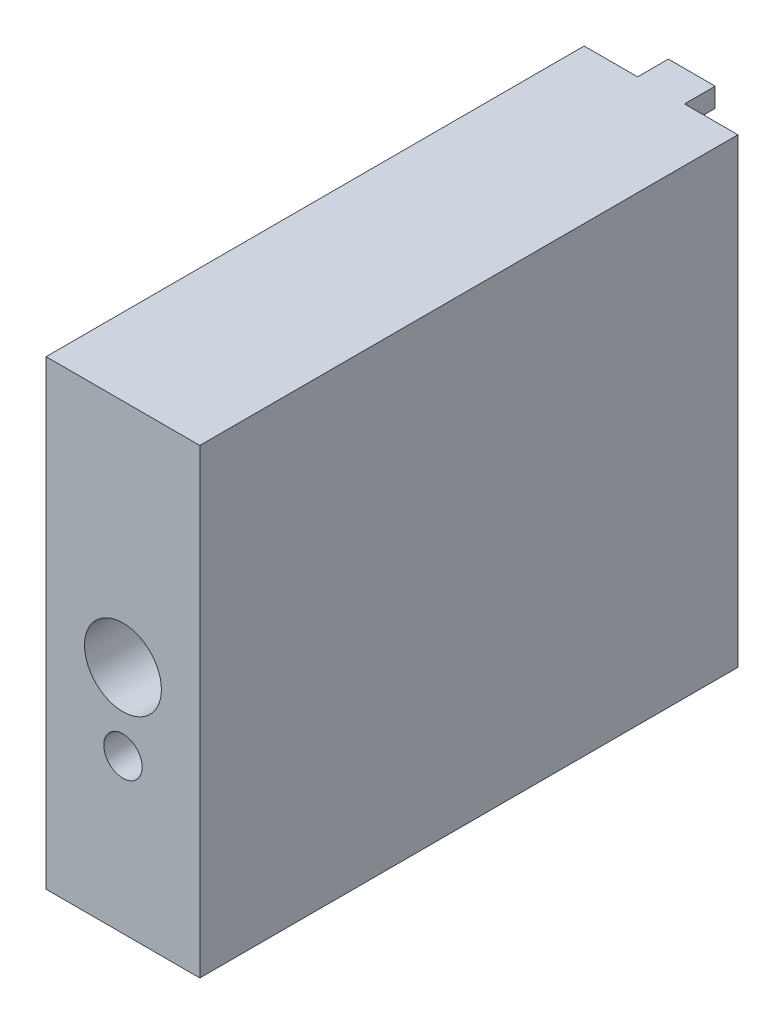
ISO-10303-21;
HEADER;
FILE_DESCRIPTION(('STEP AP214'),'2;1');
FILE_NAME('part.step','',(''),(''),'','','');
FILE_SCHEMA(('AUTOMOTIVE_DESIGN { 1 0 10303 214 1 1 1 1 }'));
ENDSEC;
DATA;
#1=APPLICATION_CONTEXT('core data for automotive mechanical design processes');
#2=APPLICATION_PROTOCOL_DEFINITION('international standard','automotive_design',2000,#1);
#3=PRODUCT_CONTEXT('',#1,'mechanical');
#4=PRODUCT('Part','Part','',(#3));
#5=PRODUCT_RELATED_PRODUCT_CATEGORY('part','',(#4));
#6=PRODUCT_DEFINITION_FORMATION('','',#4);
#7=PRODUCT_DEFINITION_CONTEXT('part definition',#1,'design');
#8=PRODUCT_DEFINITION('design','',#6,#7);
#9=PRODUCT_DEFINITION_SHAPE('','',#8);
#10=(LENGTH_UNIT() NAMED_UNIT(*) SI_UNIT(.MILLI.,.METRE.));
#11=(NAMED_UNIT(*) PLANE_ANGLE_UNIT() SI_UNIT($,.RADIAN.));
#12=(NAMED_UNIT(*) SI_UNIT($,.STERADIAN.) SOLID_ANGLE_UNIT());
#13=UNCERTAINTY_MEASURE_WITH_UNIT(LENGTH_MEASURE(1.E-05),#10,'distance_accuracy_value','');
#14=(GEOMETRIC_REPRESENTATION_CONTEXT(3) GLOBAL_UNCERTAINTY_ASSIGNED_CONTEXT((#13)) GLOBAL_UNIT_ASSIGNED_CONTEXT((#10,
#11,#12)) REPRESENTATION_CONTEXT('',''));
#15=CARTESIAN_POINT('',(0.,0.,0.));
#16=DIRECTION('',(0.,0.,1.));
#17=DIRECTION('',(1.,0.,0.));
#18=AXIS2_PLACEMENT_3D('',#15,#16,#17);
#19=CARTESIAN_POINT('',(10.,0.,-22.3));
#20=DIRECTION('',(0.,0.,-1.));
#21=DIRECTION('',(0.,1.,0.));
#22=AXIS2_PLACEMENT_3D('',#19,#20,#21);
#23=PLANE('',#22);
#24=CARTESIAN_POINT('',(0.,0.,-22.3));
#25=DIRECTION('',(0.,0.,-1.));
#26=DIRECTION('',(0.,1.,0.));
#27=AXIS2_PLACEMENT_3D('',#24,#25,#26);
#28=CIRCLE('',#27,2.6);
#29=CARTESIAN_POINT('',(0.,2.6,-22.3));
#30=VERTEX_POINT('',#29);
#31=EDGE_CURVE('E438',#30,#30,#28,.T.);
#32=ORIENTED_EDGE('',*,*,#31,.F.);
#33=EDGE_LOOP('',(#32));
#34=FACE_BOUND('',#33,.T.);
#35=DIRECTION('',(0.,1.,0.));
#36=VECTOR('',#35,1.);
#37=CARTESIAN_POINT('',(-7.50000000000001,0.,-22.3));
#38=LINE('',#37,#36);
#39=CARTESIAN_POINT('',(-7.50000000000001,-27.5,-22.3));
#40=VERTEX_POINT('',#39);
#41=CARTESIAN_POINT('',(-7.50000000000001,-15.,-22.3));
#42=VERTEX_POINT('',#41);
#43=EDGE_CURVE('E12',#40,#42,#38,.T.);
#44=ORIENTED_EDGE('',*,*,#43,.F.);
#45=DIRECTION('',(1.,0.,0.));
#46=VECTOR('',#45,1.);
#47=CARTESIAN_POINT('',(9.99999999999997,-27.5,-22.3));
#48=LINE('',#47,#46);
#49=CARTESIAN_POINT('',(-3.05,-27.5,-22.3));
#50=VERTEX_POINT('',#49);
#51=EDGE_CURVE('E377',#40,#50,#48,.T.);
#52=ORIENTED_EDGE('',*,*,#51,.T.);
#53=DIRECTION('',(0.,-1.,0.));
#54=VECTOR('',#53,1.);
#55=CARTESIAN_POINT('',(-3.05,0.,-22.3));
#56=LINE('',#55,#54);
#57=CARTESIAN_POINT('',(-3.05,-30.,-22.3));
#58=VERTEX_POINT('',#57);
#59=EDGE_CURVE('E504',#50,#58,#56,.T.);
#60=ORIENTED_EDGE('',*,*,#59,.T.);
#61=DIRECTION('',(-1.,0.,0.));
#62=VECTOR('',#61,1.);
#63=CARTESIAN_POINT('',(10.,-30.,-22.3));
#64=LINE('',#63,#62);
#65=CARTESIAN_POINT('',(-10.,-30.,-22.3));
#66=VERTEX_POINT('',#65);
#67=EDGE_CURVE('E528',#58,#66,#64,.T.);
#68=ORIENTED_EDGE('',*,*,#67,.T.);
#69=DIRECTION('',(0.,-1.,0.));
#70=VECTOR('',#69,1.);
#71=CARTESIAN_POINT('',(-10.,0.,-22.3));
#72=LINE('',#71,#70);
#73=CARTESIAN_POINT('',(-10.,30.,-22.3));
#74=VERTEX_POINT('',#73);
#75=EDGE_CURVE('E517',#74,#66,#72,.T.);
#76=ORIENTED_EDGE('',*,*,#75,.F.);
#77=DIRECTION('',(-1.,0.,0.));
#78=VECTOR('',#77,1.);
#79=CARTESIAN_POINT('',(9.99999999999999,30.,-22.3));
#80=LINE('',#79,#78);
#81=CARTESIAN_POINT('',(-3.05,30.,-22.3));
#82=VERTEX_POINT('',#81);
#83=EDGE_CURVE('E521',#82,#74,#80,.T.);
#84=ORIENTED_EDGE('',*,*,#83,.F.);
#85=CARTESIAN_POINT('',(-3.05,27.5,-22.3));
#86=VERTEX_POINT('',#85);
#87=EDGE_CURVE('E507',#82,#86,#56,.T.);
#88=ORIENTED_EDGE('',*,*,#87,.T.);
#89=DIRECTION('',(-1.,0.,0.));
#90=VECTOR('',#89,1.);
#91=CARTESIAN_POINT('',(10.,27.5,-22.3));
#92=LINE('',#91,#90);
#93=CARTESIAN_POINT('',(-7.50000000000001,27.5,-22.3));
#94=VERTEX_POINT('',#93);
#95=EDGE_CURVE('E547',#86,#94,#92,.T.);
#96=ORIENTED_EDGE('',*,*,#95,.T.);
#97=DIRECTION('',(0.,-1.,0.));
#98=VECTOR('',#97,1.);
#99=CARTESIAN_POINT('',(-7.50000000000001,0.,-22.3));
#100=LINE('',#99,#98);
#101=CARTESIAN_POINT('',(-7.50000000000001,12.5,-22.3));
#102=VERTEX_POINT('',#101);
#103=EDGE_CURVE('E543',#94,#102,#100,.T.);
#104=ORIENTED_EDGE('',*,*,#103,.T.);
#105=DIRECTION('',(-1.,0.,0.));
#106=VECTOR('',#105,1.);
#107=CARTESIAN_POINT('',(10.,12.5,-22.3));
#108=LINE('',#107,#106);
#109=CARTESIAN_POINT('',(-3.05,12.5,-22.3));
#110=VERTEX_POINT('',#109);
#111=EDGE_CURVE('E539',#110,#102,#108,.T.);
#112=ORIENTED_EDGE('',*,*,#111,.F.);
#113=CARTESIAN_POINT('',(-3.05,3.05,-22.3));
#114=VERTEX_POINT('',#113);
#115=EDGE_CURVE('E510',#110,#114,#56,.T.);
#116=ORIENTED_EDGE('',*,*,#115,.T.);
#117=DIRECTION('',(-1.,0.,0.));
#118=VECTOR('',#117,1.);
#119=CARTESIAN_POINT('',(0.,3.05,-22.3));
#120=LINE('',#119,#118);
#121=CARTESIAN_POINT('',(3.05,3.05,-22.3));
#122=VERTEX_POINT('',#121);
#123=EDGE_CURVE('E463',#122,#114,#120,.T.);
#124=ORIENTED_EDGE('',*,*,#123,.F.);
#125=DIRECTION('',(0.,-1.,0.));
#126=VECTOR('',#125,1.);
#127=CARTESIAN_POINT('',(3.05,0.,-22.3));
#128=LINE('',#127,#126);
#129=CARTESIAN_POINT('',(3.05,12.5,-22.3));
#130=VERTEX_POINT('',#129);
#131=EDGE_CURVE('E505',#130,#122,#128,.T.);
#132=ORIENTED_EDGE('',*,*,#131,.F.);
#133=CARTESIAN_POINT('',(7.49999999999999,12.5,-22.3));
#134=VERTEX_POINT('',#133);
#135=EDGE_CURVE('E544',#134,#130,#108,.T.);
#136=ORIENTED_EDGE('',*,*,#135,.F.);
#137=DIRECTION('',(0.,-1.,0.));
#138=VECTOR('',#137,1.);
#139=CARTESIAN_POINT('',(7.49999999999999,0.,-22.3));
#140=LINE('',#139,#138);
#141=CARTESIAN_POINT('',(7.49999999999999,27.5,-22.3));
#142=VERTEX_POINT('',#141);
#143=EDGE_CURVE('E551',#142,#134,#140,.T.);
#144=ORIENTED_EDGE('',*,*,#143,.F.);
#145=CARTESIAN_POINT('',(3.05,27.5,-22.3));
#146=VERTEX_POINT('',#145);
#147=EDGE_CURVE('E550',#142,#146,#92,.T.);
#148=ORIENTED_EDGE('',*,*,#147,.T.);
#149=CARTESIAN_POINT('',(3.05,30.,-22.3));
#150=VERTEX_POINT('',#149);
#151=EDGE_CURVE('E501',#150,#146,#128,.T.);
#152=ORIENTED_EDGE('',*,*,#151,.F.);
#153=CARTESIAN_POINT('',(9.99999999999999,30.,-22.3));
#154=VERTEX_POINT('',#153);
#155=EDGE_CURVE('E529',#154,#150,#80,.T.);
#156=ORIENTED_EDGE('',*,*,#155,.F.);
#157=DIRECTION('',(0.,-1.,0.));
#158=VECTOR('',#157,1.);
#159=CARTESIAN_POINT('',(10.,0.,-22.3));
#160=LINE('',#159,#158);
#161=CARTESIAN_POINT('',(10.,-30.,-22.3));
#162=VERTEX_POINT('',#161);
#163=EDGE_CURVE('E518',#154,#162,#160,.T.);
#164=ORIENTED_EDGE('',*,*,#163,.T.);
#165=CARTESIAN_POINT('',(3.05,-30.,-22.3));
#166=VERTEX_POINT('',#165);
#167=EDGE_CURVE('E524',#162,#166,#64,.T.);
#168=ORIENTED_EDGE('',*,*,#167,.T.);
#169=CARTESIAN_POINT('',(3.05,-27.5,-22.3));
#170=VERTEX_POINT('',#169);
#171=EDGE_CURVE('E477',#170,#166,#128,.T.);
#172=ORIENTED_EDGE('',*,*,#171,.F.);
#173=CARTESIAN_POINT('',(7.5,-27.5,-22.3));
#174=VERTEX_POINT('',#173);
#175=EDGE_CURVE('E381',#170,#174,#48,.T.);
#176=ORIENTED_EDGE('',*,*,#175,.T.);
#177=DIRECTION('',(0.,1.,0.));
#178=VECTOR('',#177,1.);
#179=CARTESIAN_POINT('',(7.5,0.,-22.3));
#180=LINE('',#179,#178);
#181=CARTESIAN_POINT('',(7.5,-15.,-22.3));
#182=VERTEX_POINT('',#181);
#183=EDGE_CURVE('E159',#174,#182,#180,.T.);
#184=ORIENTED_EDGE('',*,*,#183,.T.);
#185=DIRECTION('',(1.,0.,0.));
#186=VECTOR('',#185,1.);
#187=CARTESIAN_POINT('',(10.,-15.,-22.3));
#188=LINE('',#187,#186);
#189=CARTESIAN_POINT('',(3.05,-15.,-22.3));
#190=VERTEX_POINT('',#189);
#191=EDGE_CURVE('E371',#190,#182,#188,.T.);
#192=ORIENTED_EDGE('',*,*,#191,.F.);
#193=CARTESIAN_POINT('',(3.05,-3.05,-22.3));
#194=VERTEX_POINT('',#193);
#195=EDGE_CURVE('E506',#194,#190,#128,.T.);
#196=ORIENTED_EDGE('',*,*,#195,.F.);
#197=DIRECTION('',(-1.,0.,0.));
#198=VECTOR('',#197,1.);
#199=CARTESIAN_POINT('',(0.,-3.05,-22.3));
#200=LINE('',#199,#198);
#201=CARTESIAN_POINT('',(-3.05,-3.05,-22.3));
#202=VERTEX_POINT('',#201);
#203=EDGE_CURVE('E466',#194,#202,#200,.T.);
#204=ORIENTED_EDGE('',*,*,#203,.T.);
#205=CARTESIAN_POINT('',(-3.05,-15.,-22.3));
#206=VERTEX_POINT('',#205);
#207=EDGE_CURVE('E511',#202,#206,#56,.T.);
#208=ORIENTED_EDGE('',*,*,#207,.T.);
#209=EDGE_CURVE('E368',#42,#206,#188,.T.);
#210=ORIENTED_EDGE('',*,*,#209,.F.);
#211=EDGE_LOOP('',(#44,#52,#60,#68,#76,#84,#88,#96,#104,#112,#116,#124,#132,#136,#144,#148,#152,
#156,#164,#168,#172,#176,#184,#192,#196,#204,#208,#210));
#212=FACE_BOUND('',#211,.T.);
#213=ADVANCED_FACE('F151',(#34,#212),#23,.T.);
#214=CARTESIAN_POINT('',(3.05,0.,-26.3));
#215=DIRECTION('',(-1.,0.,0.));
#216=DIRECTION('',(0.,0.,1.));
#217=AXIS2_PLACEMENT_3D('',#214,#215,#216);
#218=PLANE('',#217);
#219=DIRECTION('',(0.,0.,-1.));
#220=VECTOR('',#219,1.);
#221=CARTESIAN_POINT('',(3.05,-27.5,-26.3));
#222=LINE('',#221,#220);
#223=CARTESIAN_POINT('',(3.05,-27.5,-26.3));
#224=VERTEX_POINT('',#223);
#225=EDGE_CURVE('E380',#170,#224,#222,.T.);
#226=ORIENTED_EDGE('',*,*,#225,.F.);
#227=ORIENTED_EDGE('',*,*,#171,.T.);
#228=DIRECTION('',(0.,0.,1.));
#229=VECTOR('',#228,1.);
#230=CARTESIAN_POINT('',(3.05,-30.,-26.3));
#231=LINE('',#230,#229);
#232=CARTESIAN_POINT('',(3.05,-30.,-26.3));
#233=VERTEX_POINT('',#232);
#234=EDGE_CURVE('E514',#233,#166,#231,.T.);
#235=ORIENTED_EDGE('',*,*,#234,.F.);
#236=DIRECTION('',(0.,-1.,0.));
#237=VECTOR('',#236,1.);
#238=CARTESIAN_POINT('',(3.05,0.,-26.3));
#239=LINE('',#238,#237);
#240=EDGE_CURVE('E490',#224,#233,#239,.T.);
#241=ORIENTED_EDGE('',*,*,#240,.F.);
#242=EDGE_LOOP('',(#226,#227,#235,#241));
#243=FACE_BOUND('',#242,.T.);
#244=ADVANCED_FACE('F613',(#243),#218,.F.);
#245=CARTESIAN_POINT('',(-3.05,0.,-26.3));
#246=DIRECTION('',(-1.,0.,0.));
#247=DIRECTION('',(0.,0.,1.));
#248=AXIS2_PLACEMENT_3D('',#245,#246,#247);
#249=PLANE('',#248);
#250=ORIENTED_EDGE('',*,*,#59,.F.);
#251=DIRECTION('',(0.,0.,-1.));
#252=VECTOR('',#251,1.);
#253=CARTESIAN_POINT('',(-3.05,-27.5,-26.3));
#254=LINE('',#253,#252);
#255=CARTESIAN_POINT('',(-3.05,-27.5,-26.3));
#256=VERTEX_POINT('',#255);
#257=EDGE_CURVE('E374',#50,#256,#254,.T.);
#258=ORIENTED_EDGE('',*,*,#257,.T.);
#259=DIRECTION('',(0.,-1.,0.));
#260=VECTOR('',#259,1.);
#261=CARTESIAN_POINT('',(-3.05,0.,-26.3));
#262=LINE('',#261,#260);
#263=CARTESIAN_POINT('',(-3.05,-30.,-26.3));
#264=VERTEX_POINT('',#263);
#265=EDGE_CURVE('E494',#256,#264,#262,.T.);
#266=ORIENTED_EDGE('',*,*,#265,.T.);
#267=DIRECTION('',(0.,0.,1.));
#268=VECTOR('',#267,1.);
#269=CARTESIAN_POINT('',(-3.05,-30.,-26.3));
#270=LINE('',#269,#268);
#271=EDGE_CURVE('E498',#264,#58,#270,.T.);
#272=ORIENTED_EDGE('',*,*,#271,.T.);
#273=EDGE_LOOP('',(#250,#258,#266,#272));
#274=FACE_BOUND('',#273,.T.);
#275=ADVANCED_FACE('F581',(#274),#249,.T.);
#276=CARTESIAN_POINT('',(0.,0.,-26.3));
#277=DIRECTION('',(0.,0.,-1.));
#278=DIRECTION('',(0.,1.,0.));
#279=AXIS2_PLACEMENT_3D('',#276,#277,#278);
#280=PLANE('',#279);
#281=ORIENTED_EDGE('',*,*,#265,.F.);
#282=DIRECTION('',(1.,0.,0.));
#283=VECTOR('',#282,1.);
#284=CARTESIAN_POINT('',(0.,-27.5,-26.3));
#285=LINE('',#284,#283);
#286=EDGE_CURVE('E555',#256,#224,#285,.T.);
#287=ORIENTED_EDGE('',*,*,#286,.T.);
#288=ORIENTED_EDGE('',*,*,#240,.T.);
#289=DIRECTION('',(-1.,0.,0.));
#290=VECTOR('',#289,1.);
#291=CARTESIAN_POINT('',(0.,-30.,-26.3));
#292=LINE('',#291,#290);
#293=EDGE_CURVE('E488',#233,#264,#292,.T.);
#294=ORIENTED_EDGE('',*,*,#293,.T.);
#295=EDGE_LOOP('',(#281,#287,#288,#294));
#296=FACE_BOUND('',#295,.T.);
#297=ADVANCED_FACE('F585',(#296),#280,.T.);
#298=DIRECTION('',(0.,0.,1.));
#299=VECTOR('',#298,1.);
#300=CARTESIAN_POINT('',(3.05,27.5,-26.3));
#301=LINE('',#300,#299);
#302=CARTESIAN_POINT('',(3.05,27.5,-26.3));
#303=VERTEX_POINT('',#302);
#304=EDGE_CURVE('E417',#303,#146,#301,.T.);
#305=ORIENTED_EDGE('',*,*,#304,.F.);
#306=CARTESIAN_POINT('',(3.05,30.,-26.3));
#307=VERTEX_POINT('',#306);
#308=EDGE_CURVE('E485',#307,#303,#239,.T.);
#309=ORIENTED_EDGE('',*,*,#308,.F.);
#310=DIRECTION('',(0.,0.,-1.));
#311=VECTOR('',#310,1.);
#312=CARTESIAN_POINT('',(3.05,30.,-22.3));
#313=LINE('',#312,#311);
#314=EDGE_CURVE('E457',#150,#307,#313,.T.);
#315=ORIENTED_EDGE('',*,*,#314,.F.);
#316=ORIENTED_EDGE('',*,*,#151,.T.);
#317=EDGE_LOOP('',(#305,#309,#315,#316));
#318=FACE_BOUND('',#317,.T.);
#319=ADVANCED_FACE('F646',(#318),#218,.F.);
#320=CARTESIAN_POINT('',(-3.05,30.,-26.3));
#321=VERTEX_POINT('',#320);
#322=CARTESIAN_POINT('',(-3.05,27.5,-26.3));
#323=VERTEX_POINT('',#322);
#324=EDGE_CURVE('E495',#321,#323,#262,.T.);
#325=ORIENTED_EDGE('',*,*,#324,.T.);
#326=DIRECTION('',(0.,0.,1.));
#327=VECTOR('',#326,1.);
#328=CARTESIAN_POINT('',(-3.05,27.5,-26.3));
#329=LINE('',#328,#327);
#330=EDGE_CURVE('E414',#323,#86,#329,.T.);
#331=ORIENTED_EDGE('',*,*,#330,.T.);
#332=ORIENTED_EDGE('',*,*,#87,.F.);
#333=DIRECTION('',(0.,0.,-1.));
#334=VECTOR('',#333,1.);
#335=CARTESIAN_POINT('',(-3.05,30.,-22.3));
#336=LINE('',#335,#334);
#337=EDGE_CURVE('E456',#82,#321,#336,.T.);
#338=ORIENTED_EDGE('',*,*,#337,.T.);
#339=EDGE_LOOP('',(#325,#331,#332,#338));
#340=FACE_BOUND('',#339,.T.);
#341=ADVANCED_FACE('F665',(#340),#249,.T.);
#342=ORIENTED_EDGE('',*,*,#308,.T.);
#343=DIRECTION('',(-1.,0.,0.));
#344=VECTOR('',#343,1.);
#345=CARTESIAN_POINT('',(0.,27.5,-26.3));
#346=LINE('',#345,#344);
#347=EDGE_CURVE('E387',#303,#323,#346,.T.);
#348=ORIENTED_EDGE('',*,*,#347,.T.);
#349=ORIENTED_EDGE('',*,*,#324,.F.);
#350=DIRECTION('',(1.,0.,0.));
#351=VECTOR('',#350,1.);
#352=CARTESIAN_POINT('',(3.05,30.,-26.3));
#353=LINE('',#352,#351);
#354=EDGE_CURVE('E451',#321,#307,#353,.T.);
#355=ORIENTED_EDGE('',*,*,#354,.T.);
#356=EDGE_LOOP('',(#342,#348,#349,#355));
#357=FACE_BOUND('',#356,.T.);
#358=ADVANCED_FACE('F637',(#357),#280,.T.);
#359=CARTESIAN_POINT('',(0.,0.,47.7));
#360=DIRECTION('',(0.,0.,-1.));
#361=DIRECTION('',(0.,1.,0.));
#362=AXIS2_PLACEMENT_3D('',#359,#360,#361);
#363=CYLINDRICAL_SURFACE('',#362,2.6);
#364=ORIENTED_EDGE('',*,*,#31,.T.);
#365=EDGE_LOOP('',(#364));
#366=FACE_BOUND('',#365,.T.);
#367=CARTESIAN_POINT('',(0.,0.,-19.3));
#368=DIRECTION('',(0.,0.,1.));
#369=DIRECTION('',(1.,0.,0.));
#370=AXIS2_PLACEMENT_3D('',#367,#368,#369);
#371=CIRCLE('',#370,2.6);
#372=CARTESIAN_POINT('',(2.6,0.,-19.3));
#373=VERTEX_POINT('',#372);
#374=EDGE_CURVE('E435',#373,#373,#371,.F.);
#375=ORIENTED_EDGE('',*,*,#374,.F.);
#376=EDGE_LOOP('',(#375));
#377=FACE_BOUND('',#376,.T.);
#378=ADVANCED_FACE('F652',(#366,#377),#363,.F.);
#379=CARTESIAN_POINT('',(0.,30.,0.));
#380=DIRECTION('',(0.,-1.,0.));
#381=DIRECTION('',(0.,0.,-1.));
#382=AXIS2_PLACEMENT_3D('',#379,#380,#381);
#383=PLANE('',#382);
#384=ORIENTED_EDGE('',*,*,#337,.F.);
#385=ORIENTED_EDGE('',*,*,#83,.T.);
#386=DIRECTION('',(0.,0.,1.));
#387=VECTOR('',#386,1.);
#388=CARTESIAN_POINT('',(-10.,30.,14.));
#389=LINE('',#388,#387);
#390=CARTESIAN_POINT('',(-10.,30.,47.7));
#391=VERTEX_POINT('',#390);
#392=EDGE_CURVE('E527',#74,#391,#389,.T.);
#393=ORIENTED_EDGE('',*,*,#392,.T.);
#394=DIRECTION('',(-1.,0.,0.));
#395=VECTOR('',#394,1.);
#396=CARTESIAN_POINT('',(9.99999999999999,30.,47.7));
#397=LINE('',#396,#395);
#398=CARTESIAN_POINT('',(9.99999999999999,30.,47.7));
#399=VERTEX_POINT('',#398);
#400=EDGE_CURVE('E448',#399,#391,#397,.T.);
#401=ORIENTED_EDGE('',*,*,#400,.F.);
#402=DIRECTION('',(0.,0.,-1.));
#403=VECTOR('',#402,1.);
#404=CARTESIAN_POINT('',(9.99999999999999,30.,14.));
#405=LINE('',#404,#403);
#406=EDGE_CURVE('E533',#399,#154,#405,.T.);
#407=ORIENTED_EDGE('',*,*,#406,.T.);
#408=ORIENTED_EDGE('',*,*,#155,.T.);
#409=ORIENTED_EDGE('',*,*,#314,.T.);
#410=ORIENTED_EDGE('',*,*,#354,.F.);
#411=EDGE_LOOP('',(#384,#385,#393,#401,#407,#408,#409,#410));
#412=FACE_BOUND('',#411,.T.);
#413=ADVANCED_FACE('F626',(#412),#383,.F.);
#414=CARTESIAN_POINT('',(3.05,12.5,-26.3));
#415=VERTEX_POINT('',#414);
#416=CARTESIAN_POINT('',(3.05,3.05,-26.3));
#417=VERTEX_POINT('',#416);
#418=EDGE_CURVE('E489',#415,#417,#239,.T.);
#419=ORIENTED_EDGE('',*,*,#418,.F.);
#420=DIRECTION('',(0.,0.,1.));
#421=VECTOR('',#420,1.);
#422=CARTESIAN_POINT('',(3.05,12.5,-26.3));
#423=LINE('',#422,#421);
#424=EDGE_CURVE('E411',#415,#130,#423,.T.);
#425=ORIENTED_EDGE('',*,*,#424,.T.);
#426=ORIENTED_EDGE('',*,*,#131,.T.);
#427=DIRECTION('',(0.,0.,-1.));
#428=VECTOR('',#427,1.);
#429=CARTESIAN_POINT('',(3.05,3.05,-22.3));
#430=LINE('',#429,#428);
#431=EDGE_CURVE('E470',#122,#417,#430,.T.);
#432=ORIENTED_EDGE('',*,*,#431,.T.);
#433=EDGE_LOOP('',(#419,#425,#426,#432));
#434=FACE_BOUND('',#433,.T.);
#435=ADVANCED_FACE('F610',(#434),#218,.F.);
#436=DIRECTION('',(0.,0.,1.));
#437=VECTOR('',#436,1.);
#438=CARTESIAN_POINT('',(-3.05,12.5,-26.3));
#439=LINE('',#438,#437);
#440=CARTESIAN_POINT('',(-3.05,12.5,-26.3));
#441=VERTEX_POINT('',#440);
#442=EDGE_CURVE('E174',#441,#110,#439,.T.);
#443=ORIENTED_EDGE('',*,*,#442,.F.);
#444=CARTESIAN_POINT('',(-3.05,3.05,-26.3));
#445=VERTEX_POINT('',#444);
#446=EDGE_CURVE('E499',#441,#445,#262,.T.);
#447=ORIENTED_EDGE('',*,*,#446,.T.);
#448=DIRECTION('',(0.,0.,-1.));
#449=VECTOR('',#448,1.);
#450=CARTESIAN_POINT('',(-3.05,3.05,-22.3));
#451=LINE('',#450,#449);
#452=EDGE_CURVE('E474',#114,#445,#451,.T.);
#453=ORIENTED_EDGE('',*,*,#452,.F.);
#454=ORIENTED_EDGE('',*,*,#115,.F.);
#455=EDGE_LOOP('',(#443,#447,#453,#454));
#456=FACE_BOUND('',#455,.T.);
#457=ADVANCED_FACE('F603',(#456),#249,.T.);
#458=DIRECTION('',(-1.,0.,0.));
#459=VECTOR('',#458,1.);
#460=CARTESIAN_POINT('',(0.,12.5,-26.3));
#461=LINE('',#460,#459);
#462=EDGE_CURVE('E395',#415,#441,#461,.T.);
#463=ORIENTED_EDGE('',*,*,#462,.F.);
#464=ORIENTED_EDGE('',*,*,#418,.T.);
#465=DIRECTION('',(-1.,0.,0.));
#466=VECTOR('',#465,1.);
#467=CARTESIAN_POINT('',(0.,3.05,-26.3));
#468=LINE('',#467,#466);
#469=EDGE_CURVE('E460',#417,#445,#468,.T.);
#470=ORIENTED_EDGE('',*,*,#469,.T.);
#471=ORIENTED_EDGE('',*,*,#446,.F.);
#472=EDGE_LOOP('',(#463,#464,#470,#471));
#473=FACE_BOUND('',#472,.T.);
#474=ADVANCED_FACE('F607',(#473),#280,.T.);
#475=CARTESIAN_POINT('',(-10.,28.,4.));
#476=DIRECTION('',(1.,0.,0.));
#477=DIRECTION('',(0.,1.,0.));
#478=AXIS2_PLACEMENT_3D('',#475,#476,#477);
#479=PLANE('',#478);
#480=DIRECTION('',(0.,0.,1.));
#481=VECTOR('',#480,1.);
#482=CARTESIAN_POINT('',(-10.,-30.,4.));
#483=LINE('',#482,#481);
#484=CARTESIAN_POINT('',(-10.,-30.,47.7));
#485=VERTEX_POINT('',#484);
#486=EDGE_CURVE('E535',#66,#485,#483,.T.);
#487=ORIENTED_EDGE('',*,*,#486,.T.);
#488=DIRECTION('',(0.,1.,0.));
#489=VECTOR('',#488,1.);
#490=CARTESIAN_POINT('',(-10.,-30.,47.7));
#491=LINE('',#490,#489);
#492=EDGE_CURVE('E441',#485,#391,#491,.T.);
#493=ORIENTED_EDGE('',*,*,#492,.T.);
#494=ORIENTED_EDGE('',*,*,#392,.F.);
#495=ORIENTED_EDGE('',*,*,#75,.T.);
#496=EDGE_LOOP('',(#487,#493,#494,#495));
#497=FACE_BOUND('',#496,.T.);
#498=ADVANCED_FACE('F629',(#497),#479,.F.);
#499=CARTESIAN_POINT('',(9.99999999999999,28.,4.));
#500=DIRECTION('',(1.,0.,0.));
#501=DIRECTION('',(0.,1.,0.));
#502=AXIS2_PLACEMENT_3D('',#499,#500,#501);
#503=PLANE('',#502);
#504=ORIENTED_EDGE('',*,*,#406,.F.);
#505=DIRECTION('',(0.,1.,0.));
#506=VECTOR('',#505,1.);
#507=CARTESIAN_POINT('',(10.,-30.,47.7));
#508=LINE('',#507,#506);
#509=CARTESIAN_POINT('',(10.,-30.,47.7));
#510=VERTEX_POINT('',#509);
#511=EDGE_CURVE('E442',#510,#399,#508,.T.);
#512=ORIENTED_EDGE('',*,*,#511,.F.);
#513=DIRECTION('',(0.,0.,-1.));
#514=VECTOR('',#513,1.);
#515=CARTESIAN_POINT('',(10.,-30.,14.));
#516=LINE('',#515,#514);
#517=EDGE_CURVE('E537',#510,#162,#516,.T.);
#518=ORIENTED_EDGE('',*,*,#517,.T.);
#519=ORIENTED_EDGE('',*,*,#163,.F.);
#520=EDGE_LOOP('',(#504,#512,#518,#519));
#521=FACE_BOUND('',#520,.T.);
#522=ADVANCED_FACE('F153',(#521),#503,.T.);
#523=CARTESIAN_POINT('',(0.,-30.,0.));
#524=DIRECTION('',(0.,1.,0.));
#525=DIRECTION('',(0.,0.,1.));
#526=AXIS2_PLACEMENT_3D('',#523,#524,#525);
#527=PLANE('',#526);
#528=ORIENTED_EDGE('',*,*,#234,.T.);
#529=ORIENTED_EDGE('',*,*,#167,.F.);
#530=ORIENTED_EDGE('',*,*,#517,.F.);
#531=DIRECTION('',(-1.,0.,0.));
#532=VECTOR('',#531,1.);
#533=CARTESIAN_POINT('',(10.,-30.,47.7));
#534=LINE('',#533,#532);
#535=EDGE_CURVE('E445',#510,#485,#534,.T.);
#536=ORIENTED_EDGE('',*,*,#535,.T.);
#537=ORIENTED_EDGE('',*,*,#486,.F.);
#538=ORIENTED_EDGE('',*,*,#67,.F.);
#539=ORIENTED_EDGE('',*,*,#271,.F.);
#540=ORIENTED_EDGE('',*,*,#293,.F.);
#541=EDGE_LOOP('',(#528,#529,#530,#536,#537,#538,#539,#540));
#542=FACE_BOUND('',#541,.T.);
#543=ADVANCED_FACE('F590',(#542),#527,.F.);
#544=ORIENTED_EDGE('',*,*,#195,.T.);
#545=DIRECTION('',(0.,0.,-1.));
#546=VECTOR('',#545,1.);
#547=CARTESIAN_POINT('',(3.05,-15.,-26.3));
#548=LINE('',#547,#546);
#549=CARTESIAN_POINT('',(3.05,-15.,-26.3));
#550=VERTEX_POINT('',#549);
#551=EDGE_CURVE('E370',#190,#550,#548,.T.);
#552=ORIENTED_EDGE('',*,*,#551,.T.);
#553=CARTESIAN_POINT('',(3.05,-3.05,-26.3));
#554=VERTEX_POINT('',#553);
#555=EDGE_CURVE('E491',#554,#550,#239,.T.);
#556=ORIENTED_EDGE('',*,*,#555,.F.);
#557=DIRECTION('',(0.,0.,-1.));
#558=VECTOR('',#557,1.);
#559=CARTESIAN_POINT('',(3.05,-3.05,-22.3));
#560=LINE('',#559,#558);
#561=EDGE_CURVE('E481',#194,#554,#560,.T.);
#562=ORIENTED_EDGE('',*,*,#561,.F.);
#563=EDGE_LOOP('',(#544,#552,#556,#562));
#564=FACE_BOUND('',#563,.T.);
#565=ADVANCED_FACE('F647',(#564),#218,.F.);
#566=DIRECTION('',(0.,0.,-1.));
#567=VECTOR('',#566,1.);
#568=CARTESIAN_POINT('',(-3.05,-15.,-26.3));
#569=LINE('',#568,#567);
#570=CARTESIAN_POINT('',(-3.05,-15.,-26.3));
#571=VERTEX_POINT('',#570);
#572=EDGE_CURVE('E166',#206,#571,#569,.T.);
#573=ORIENTED_EDGE('',*,*,#572,.F.);
#574=ORIENTED_EDGE('',*,*,#207,.F.);
#575=DIRECTION('',(0.,0.,-1.));
#576=VECTOR('',#575,1.);
#577=CARTESIAN_POINT('',(-3.05,-3.05,-22.3));
#578=LINE('',#577,#576);
#579=CARTESIAN_POINT('',(-3.05,-3.05,-26.3));
#580=VERTEX_POINT('',#579);
#581=EDGE_CURVE('E478',#202,#580,#578,.T.);
#582=ORIENTED_EDGE('',*,*,#581,.T.);
#583=EDGE_CURVE('E500',#580,#571,#262,.T.);
#584=ORIENTED_EDGE('',*,*,#583,.T.);
#585=EDGE_LOOP('',(#573,#574,#582,#584));
#586=FACE_BOUND('',#585,.T.);
#587=ADVANCED_FACE('F575',(#586),#249,.T.);
#588=DIRECTION('',(1.,0.,0.));
#589=VECTOR('',#588,1.);
#590=CARTESIAN_POINT('',(0.,-15.,-26.3));
#591=LINE('',#590,#589);
#592=EDGE_CURVE('E553',#571,#550,#591,.T.);
#593=ORIENTED_EDGE('',*,*,#592,.F.);
#594=ORIENTED_EDGE('',*,*,#583,.F.);
#595=DIRECTION('',(-1.,0.,0.));
#596=VECTOR('',#595,1.);
#597=CARTESIAN_POINT('',(0.,-3.05,-26.3));
#598=LINE('',#597,#596);
#599=EDGE_CURVE('E467',#554,#580,#598,.T.);
#600=ORIENTED_EDGE('',*,*,#599,.F.);
#601=ORIENTED_EDGE('',*,*,#555,.T.);
#602=EDGE_LOOP('',(#593,#594,#600,#601));
#603=FACE_BOUND('',#602,.T.);
#604=ADVANCED_FACE('F636',(#603),#280,.T.);
#605=CARTESIAN_POINT('',(0.,3.05,-22.3));
#606=DIRECTION('',(0.,-1.,0.));
#607=DIRECTION('',(0.,0.,-1.));
#608=AXIS2_PLACEMENT_3D('',#605,#606,#607);
#609=PLANE('',#608);
#610=ORIENTED_EDGE('',*,*,#469,.F.);
#611=ORIENTED_EDGE('',*,*,#431,.F.);
#612=ORIENTED_EDGE('',*,*,#123,.T.);
#613=ORIENTED_EDGE('',*,*,#452,.T.);
#614=EDGE_LOOP('',(#610,#611,#612,#613));
#615=FACE_BOUND('',#614,.T.);
#616=ADVANCED_FACE('F602',(#615),#609,.T.);
#617=CARTESIAN_POINT('',(0.,-3.05,-22.3));
#618=DIRECTION('',(0.,-1.,0.));
#619=DIRECTION('',(1.,0.,0.));
#620=AXIS2_PLACEMENT_3D('',#617,#618,#619);
#621=PLANE('',#620);
#622=ORIENTED_EDGE('',*,*,#599,.T.);
#623=ORIENTED_EDGE('',*,*,#581,.F.);
#624=ORIENTED_EDGE('',*,*,#203,.F.);
#625=ORIENTED_EDGE('',*,*,#561,.T.);
#626=EDGE_LOOP('',(#622,#623,#624,#625));
#627=FACE_BOUND('',#626,.T.);
#628=ADVANCED_FACE('F733',(#627),#621,.F.);
#629=CARTESIAN_POINT('',(10.,-30.,47.7));
#630=DIRECTION('',(0.,0.,1.));
#631=DIRECTION('',(1.,0.,0.));
#632=AXIS2_PLACEMENT_3D('',#629,#630,#631);
#633=PLANE('',#632);
#634=CARTESIAN_POINT('',(0.,-10.,47.7));
#635=DIRECTION('',(0.,0.,1.));
#636=DIRECTION('',(1.,0.,0.));
#637=AXIS2_PLACEMENT_3D('',#634,#635,#636);
#638=CIRCLE('',#637,2.5);
#639=CARTESIAN_POINT('',(2.5,-10.,47.7));
#640=VERTEX_POINT('',#639);
#641=EDGE_CURVE('E423',#640,#640,#638,.T.);
#642=ORIENTED_EDGE('',*,*,#641,.F.);
#643=EDGE_LOOP('',(#642));
#644=FACE_BOUND('',#643,.T.);
#645=CARTESIAN_POINT('',(0.,0.,47.7));
#646=DIRECTION('',(0.,0.,1.));
#647=DIRECTION('',(1.,0.,0.));
#648=AXIS2_PLACEMENT_3D('',#645,#646,#647);
#649=CIRCLE('',#648,5.);
#650=CARTESIAN_POINT('',(5.,0.,47.7));
#651=VERTEX_POINT('',#650);
#652=EDGE_CURVE('E429',#651,#651,#649,.T.);
#653=ORIENTED_EDGE('',*,*,#652,.F.);
#654=EDGE_LOOP('',(#653));
#655=FACE_BOUND('',#654,.T.);
#656=ORIENTED_EDGE('',*,*,#492,.F.);
#657=ORIENTED_EDGE('',*,*,#535,.F.);
#658=ORIENTED_EDGE('',*,*,#511,.T.);
#659=ORIENTED_EDGE('',*,*,#400,.T.);
#660=EDGE_LOOP('',(#656,#657,#658,#659));
#661=FACE_BOUND('',#660,.T.);
#662=ADVANCED_FACE('F622',(#644,#655,#661),#633,.T.);
#663=CARTESIAN_POINT('',(0.,0.,-19.3));
#664=DIRECTION('',(0.,0.,1.));
#665=DIRECTION('',(1.,0.,0.));
#666=AXIS2_PLACEMENT_3D('',#663,#664,#665);
#667=PLANE('',#666);
#668=CARTESIAN_POINT('',(0.,0.,-19.3));
#669=DIRECTION('',(0.,0.,1.));
#670=DIRECTION('',(1.,0.,0.));
#671=AXIS2_PLACEMENT_3D('',#668,#669,#670);
#672=CIRCLE('',#671,5.);
#673=CARTESIAN_POINT('',(5.,0.,-19.3));
#674=VERTEX_POINT('',#673);
#675=EDGE_CURVE('E432',#674,#674,#672,.T.);
#676=ORIENTED_EDGE('',*,*,#675,.T.);
#677=EDGE_LOOP('',(#676));
#678=FACE_BOUND('',#677,.T.);
#679=ORIENTED_EDGE('',*,*,#374,.T.);
#680=EDGE_LOOP('',(#679));
#681=FACE_BOUND('',#680,.T.);
#682=ADVANCED_FACE('F721',(#678,#681),#667,.T.);
#683=CARTESIAN_POINT('',(0.,0.,-19.3));
#684=DIRECTION('',(0.,0.,1.));
#685=DIRECTION('',(1.,0.,0.));
#686=AXIS2_PLACEMENT_3D('',#683,#684,#685);
#687=CYLINDRICAL_SURFACE('',#686,5.);
#688=ORIENTED_EDGE('',*,*,#675,.F.);
#689=EDGE_LOOP('',(#688));
#690=FACE_BOUND('',#689,.T.);
#691=ORIENTED_EDGE('',*,*,#652,.T.);
#692=EDGE_LOOP('',(#691));
#693=FACE_BOUND('',#692,.T.);
#694=ADVANCED_FACE('F719',(#690,#693),#687,.F.);
#695=CARTESIAN_POINT('',(0.,-10.,17.7));
#696=DIRECTION('',(0.,0.,1.));
#697=DIRECTION('',(1.,0.,0.));
#698=AXIS2_PLACEMENT_3D('',#695,#696,#697);
#699=CYLINDRICAL_SURFACE('',#698,2.5);
#700=CARTESIAN_POINT('',(0.,-10.,17.7));
#701=DIRECTION('',(0.,0.,1.));
#702=DIRECTION('',(1.,0.,0.));
#703=AXIS2_PLACEMENT_3D('',#700,#701,#702);
#704=CIRCLE('',#703,2.5);
#705=CARTESIAN_POINT('',(2.5,-10.,17.7));
#706=VERTEX_POINT('',#705);
#707=EDGE_CURVE('E426',#706,#706,#704,.T.);
#708=ORIENTED_EDGE('',*,*,#707,.F.);
#709=EDGE_LOOP('',(#708));
#710=FACE_BOUND('',#709,.T.);
#711=ORIENTED_EDGE('',*,*,#641,.T.);
#712=EDGE_LOOP('',(#711));
#713=FACE_BOUND('',#712,.T.);
#714=ADVANCED_FACE('F715',(#710,#713),#699,.F.);
#715=CARTESIAN_POINT('',(0.,0.,17.7));
#716=DIRECTION('',(0.,0.,1.));
#717=DIRECTION('',(1.,0.,0.));
#718=AXIS2_PLACEMENT_3D('',#715,#716,#717);
#719=PLANE('',#718);
#720=CARTESIAN_POINT('',(0.,-10.,17.7));
#721=DIRECTION('',(0.,0.,1.));
#722=DIRECTION('',(1.,0.,0.));
#723=AXIS2_PLACEMENT_3D('',#720,#721,#722);
#724=CIRCLE('',#723,1.48);
#725=CARTESIAN_POINT('',(1.48,-10.,17.7));
#726=VERTEX_POINT('',#725);
#727=EDGE_CURVE('E419',#726,#726,#724,.T.);
#728=ORIENTED_EDGE('',*,*,#727,.F.);
#729=EDGE_LOOP('',(#728));
#730=FACE_BOUND('',#729,.T.);
#731=ORIENTED_EDGE('',*,*,#707,.T.);
#732=EDGE_LOOP('',(#731));
#733=FACE_BOUND('',#732,.T.);
#734=ADVANCED_FACE('F711',(#730,#733),#719,.T.);
#735=CARTESIAN_POINT('',(0.,-10.,7.70000000000001));
#736=DIRECTION('',(0.,0.,1.));
#737=DIRECTION('',(1.,0.,0.));
#738=AXIS2_PLACEMENT_3D('',#735,#736,#737);
#739=CYLINDRICAL_SURFACE('',#738,1.48);
#740=CARTESIAN_POINT('',(0.,-10.,7.70000000000001));
#741=DIRECTION('',(0.,0.,1.));
#742=DIRECTION('',(1.,0.,0.));
#743=AXIS2_PLACEMENT_3D('',#740,#741,#742);
#744=CIRCLE('',#743,1.48);
#745=CARTESIAN_POINT('',(1.48,-10.,7.70000000000001));
#746=VERTEX_POINT('',#745);
#747=EDGE_CURVE('E420',#746,#746,#744,.T.);
#748=ORIENTED_EDGE('',*,*,#747,.F.);
#749=EDGE_LOOP('',(#748));
#750=FACE_BOUND('',#749,.T.);
#751=ORIENTED_EDGE('',*,*,#727,.T.);
#752=EDGE_LOOP('',(#751));
#753=FACE_BOUND('',#752,.T.);
#754=ADVANCED_FACE('F707',(#750,#753),#739,.F.);
#755=CARTESIAN_POINT('',(0.,-10.,7.70000000000001));
#756=DIRECTION('',(0.,0.,1.));
#757=DIRECTION('',(1.,0.,0.));
#758=AXIS2_PLACEMENT_3D('',#755,#756,#757);
#759=PLANE('',#758);
#760=ORIENTED_EDGE('',*,*,#747,.T.);
#761=EDGE_LOOP('',(#760));
#762=FACE_BOUND('',#761,.T.);
#763=ADVANCED_FACE('F701',(#762),#759,.T.);
#764=CARTESIAN_POINT('',(0.,27.5,38.7));
#765=DIRECTION('',(0.,-1.,0.));
#766=DIRECTION('',(0.,0.,-1.));
#767=AXIS2_PLACEMENT_3D('',#764,#765,#766);
#768=PLANE('',#767);
#769=ORIENTED_EDGE('',*,*,#304,.T.);
#770=ORIENTED_EDGE('',*,*,#147,.F.);
#771=DIRECTION('',(0.,0.,-1.));
#772=VECTOR('',#771,1.);
#773=CARTESIAN_POINT('',(7.49999999999999,27.5,38.7));
#774=LINE('',#773,#772);
#775=CARTESIAN_POINT('',(7.49999999999999,27.5,38.7));
#776=VERTEX_POINT('',#775);
#777=EDGE_CURVE('E399',#776,#142,#774,.T.);
#778=ORIENTED_EDGE('',*,*,#777,.F.);
#779=DIRECTION('',(-1.,0.,0.));
#780=VECTOR('',#779,1.);
#781=CARTESIAN_POINT('',(0.,27.5,38.7));
#782=LINE('',#781,#780);
#783=CARTESIAN_POINT('',(-7.50000000000001,27.5,38.7));
#784=VERTEX_POINT('',#783);
#785=EDGE_CURVE('E392',#776,#784,#782,.T.);
#786=ORIENTED_EDGE('',*,*,#785,.T.);
#787=DIRECTION('',(0.,0.,-1.));
#788=VECTOR('',#787,1.);
#789=CARTESIAN_POINT('',(-7.50000000000001,27.5,38.7));
#790=LINE('',#789,#788);
#791=EDGE_CURVE('E402',#784,#94,#790,.T.);
#792=ORIENTED_EDGE('',*,*,#791,.T.);
#793=ORIENTED_EDGE('',*,*,#95,.F.);
#794=ORIENTED_EDGE('',*,*,#330,.F.);
#795=ORIENTED_EDGE('',*,*,#347,.F.);
#796=EDGE_LOOP('',(#769,#770,#778,#786,#792,#793,#794,#795));
#797=FACE_BOUND('',#796,.T.);
#798=ADVANCED_FACE('F680',(#797),#768,.T.);
#799=CARTESIAN_POINT('',(0.,12.5,38.7));
#800=DIRECTION('',(0.,-1.,0.));
#801=DIRECTION('',(0.,0.,-1.));
#802=AXIS2_PLACEMENT_3D('',#799,#800,#801);
#803=PLANE('',#802);
#804=ORIENTED_EDGE('',*,*,#462,.T.);
#805=ORIENTED_EDGE('',*,*,#442,.T.);
#806=ORIENTED_EDGE('',*,*,#111,.T.);
#807=DIRECTION('',(0.,0.,-1.));
#808=VECTOR('',#807,1.);
#809=CARTESIAN_POINT('',(-7.50000000000001,12.5,38.7));
#810=LINE('',#809,#808);
#811=CARTESIAN_POINT('',(-7.50000000000001,12.5,38.7));
#812=VERTEX_POINT('',#811);
#813=EDGE_CURVE('E405',#812,#102,#810,.T.);
#814=ORIENTED_EDGE('',*,*,#813,.F.);
#815=DIRECTION('',(-1.,0.,0.));
#816=VECTOR('',#815,1.);
#817=CARTESIAN_POINT('',(0.,12.5,38.7));
#818=LINE('',#817,#816);
#819=CARTESIAN_POINT('',(7.49999999999999,12.5,38.7));
#820=VERTEX_POINT('',#819);
#821=EDGE_CURVE('E386',#820,#812,#818,.T.);
#822=ORIENTED_EDGE('',*,*,#821,.F.);
#823=DIRECTION('',(0.,0.,-1.));
#824=VECTOR('',#823,1.);
#825=CARTESIAN_POINT('',(7.49999999999999,12.5,38.7));
#826=LINE('',#825,#824);
#827=EDGE_CURVE('E394',#820,#134,#826,.T.);
#828=ORIENTED_EDGE('',*,*,#827,.T.);
#829=ORIENTED_EDGE('',*,*,#135,.T.);
#830=ORIENTED_EDGE('',*,*,#424,.F.);
#831=EDGE_LOOP('',(#804,#805,#806,#814,#822,#828,#829,#830));
#832=FACE_BOUND('',#831,.T.);
#833=ADVANCED_FACE('F693',(#832),#803,.F.);
#834=CARTESIAN_POINT('',(7.49999999999999,0.,38.7));
#835=DIRECTION('',(1.,0.,0.));
#836=DIRECTION('',(0.,0.,-1.));
#837=AXIS2_PLACEMENT_3D('',#834,#835,#836);
#838=PLANE('',#837);
#839=ORIENTED_EDGE('',*,*,#143,.T.);
#840=ORIENTED_EDGE('',*,*,#827,.F.);
#841=DIRECTION('',(0.,-1.,0.));
#842=VECTOR('',#841,1.);
#843=CARTESIAN_POINT('',(7.49999999999999,0.,38.7));
#844=LINE('',#843,#842);
#845=EDGE_CURVE('E383',#776,#820,#844,.T.);
#846=ORIENTED_EDGE('',*,*,#845,.F.);
#847=ORIENTED_EDGE('',*,*,#777,.T.);
#848=EDGE_LOOP('',(#839,#840,#846,#847));
#849=FACE_BOUND('',#848,.T.);
#850=ADVANCED_FACE('F684',(#849),#838,.F.);
#851=CARTESIAN_POINT('',(-7.50000000000001,0.,38.7));
#852=DIRECTION('',(1.,0.,0.));
#853=DIRECTION('',(0.,0.,-1.));
#854=AXIS2_PLACEMENT_3D('',#851,#852,#853);
#855=PLANE('',#854);
#856=ORIENTED_EDGE('',*,*,#791,.F.);
#857=DIRECTION('',(0.,-1.,0.));
#858=VECTOR('',#857,1.);
#859=CARTESIAN_POINT('',(-7.50000000000001,0.,38.7));
#860=LINE('',#859,#858);
#861=EDGE_CURVE('E390',#784,#812,#860,.T.);
#862=ORIENTED_EDGE('',*,*,#861,.T.);
#863=ORIENTED_EDGE('',*,*,#813,.T.);
#864=ORIENTED_EDGE('',*,*,#103,.F.);
#865=EDGE_LOOP('',(#856,#862,#863,#864));
#866=FACE_BOUND('',#865,.T.);
#867=ADVANCED_FACE('F691',(#866),#855,.T.);
#868=CARTESIAN_POINT('',(0.,0.,38.7));
#869=DIRECTION('',(0.,0.,-1.));
#870=DIRECTION('',(0.,1.,0.));
#871=AXIS2_PLACEMENT_3D('',#868,#869,#870);
#872=PLANE('',#871);
#873=ORIENTED_EDGE('',*,*,#845,.T.);
#874=ORIENTED_EDGE('',*,*,#821,.T.);
#875=ORIENTED_EDGE('',*,*,#861,.F.);
#876=ORIENTED_EDGE('',*,*,#785,.F.);
#877=EDGE_LOOP('',(#873,#874,#875,#876));
#878=FACE_BOUND('',#877,.T.);
#879=ADVANCED_FACE('F687',(#878),#872,.T.);
#880=CARTESIAN_POINT('',(-7.50000000000001,0.,38.7));
#881=DIRECTION('',(-1.,0.,0.));
#882=DIRECTION('',(0.,0.,1.));
#883=AXIS2_PLACEMENT_3D('',#880,#881,#882);
#884=PLANE('',#883);
#885=ORIENTED_EDGE('',*,*,#43,.T.);
#886=DIRECTION('',(0.,0.,-1.));
#887=VECTOR('',#886,1.);
#888=CARTESIAN_POINT('',(-7.50000000000001,-15.,38.7));
#889=LINE('',#888,#887);
#890=CARTESIAN_POINT('',(-7.50000000000001,-15.,38.7));
#891=VERTEX_POINT('',#890);
#892=EDGE_CURVE('E335',#891,#42,#889,.T.);
#893=ORIENTED_EDGE('',*,*,#892,.F.);
#894=DIRECTION('',(0.,1.,0.));
#895=VECTOR('',#894,1.);
#896=CARTESIAN_POINT('',(-7.50000000000001,0.,38.7));
#897=LINE('',#896,#895);
#898=CARTESIAN_POINT('',(-7.50000000000001,-27.5,38.7));
#899=VERTEX_POINT('',#898);
#900=EDGE_CURVE('E340',#899,#891,#897,.T.);
#901=ORIENTED_EDGE('',*,*,#900,.F.);
#902=DIRECTION('',(0.,0.,-1.));
#903=VECTOR('',#902,1.);
#904=CARTESIAN_POINT('',(-7.50000000000001,-27.5,38.7));
#905=LINE('',#904,#903);
#906=EDGE_CURVE('E361',#899,#40,#905,.T.);
#907=ORIENTED_EDGE('',*,*,#906,.T.);
#908=EDGE_LOOP('',(#885,#893,#901,#907));
#909=FACE_BOUND('',#908,.T.);
#910=ADVANCED_FACE('F337',(#909),#884,.F.);
#911=CARTESIAN_POINT('',(0.,-27.5,38.7));
#912=DIRECTION('',(0.,1.,0.));
#913=DIRECTION('',(-1.,0.,0.));
#914=AXIS2_PLACEMENT_3D('',#911,#912,#913);
#915=PLANE('',#914);
#916=ORIENTED_EDGE('',*,*,#225,.T.);
#917=ORIENTED_EDGE('',*,*,#286,.F.);
#918=ORIENTED_EDGE('',*,*,#257,.F.);
#919=ORIENTED_EDGE('',*,*,#51,.F.);
#920=ORIENTED_EDGE('',*,*,#906,.F.);
#921=DIRECTION('',(1.,0.,0.));
#922=VECTOR('',#921,1.);
#923=CARTESIAN_POINT('',(0.,-27.5,38.7));
#924=LINE('',#923,#922);
#925=CARTESIAN_POINT('',(7.5,-27.5,38.7));
#926=VERTEX_POINT('',#925);
#927=EDGE_CURVE('E344',#899,#926,#924,.T.);
#928=ORIENTED_EDGE('',*,*,#927,.T.);
#929=DIRECTION('',(0.,0.,-1.));
#930=VECTOR('',#929,1.);
#931=CARTESIAN_POINT('',(7.5,-27.5,38.7));
#932=LINE('',#931,#930);
#933=EDGE_CURVE('E363',#926,#174,#932,.T.);
#934=ORIENTED_EDGE('',*,*,#933,.T.);
#935=ORIENTED_EDGE('',*,*,#175,.F.);
#936=EDGE_LOOP('',(#916,#917,#918,#919,#920,#928,#934,#935));
#937=FACE_BOUND('',#936,.T.);
#938=ADVANCED_FACE('F568',(#937),#915,.T.);
#939=CARTESIAN_POINT('',(7.5,0.,38.7));
#940=DIRECTION('',(-1.,0.,0.));
#941=DIRECTION('',(0.,0.,1.));
#942=AXIS2_PLACEMENT_3D('',#939,#940,#941);
#943=PLANE('',#942);
#944=ORIENTED_EDGE('',*,*,#933,.F.);
#945=DIRECTION('',(0.,1.,0.));
#946=VECTOR('',#945,1.);
#947=CARTESIAN_POINT('',(7.5,0.,38.7));
#948=LINE('',#947,#946);
#949=CARTESIAN_POINT('',(7.5,-15.,38.7));
#950=VERTEX_POINT('',#949);
#951=EDGE_CURVE('E353',#926,#950,#948,.T.);
#952=ORIENTED_EDGE('',*,*,#951,.T.);
#953=DIRECTION('',(0.,0.,-1.));
#954=VECTOR('',#953,1.);
#955=CARTESIAN_POINT('',(7.5,-15.,38.7));
#956=LINE('',#955,#954);
#957=EDGE_CURVE('E343',#950,#182,#956,.T.);
#958=ORIENTED_EDGE('',*,*,#957,.T.);
#959=ORIENTED_EDGE('',*,*,#183,.F.);
#960=EDGE_LOOP('',(#944,#952,#958,#959));
#961=FACE_BOUND('',#960,.T.);
#962=ADVANCED_FACE('F566',(#961),#943,.T.);
#963=CARTESIAN_POINT('',(0.,-15.,38.7));
#964=DIRECTION('',(0.,1.,0.));
#965=DIRECTION('',(0.,0.,1.));
#966=AXIS2_PLACEMENT_3D('',#963,#964,#965);
#967=PLANE('',#966);
#968=ORIENTED_EDGE('',*,*,#191,.T.);
#969=ORIENTED_EDGE('',*,*,#957,.F.);
#970=DIRECTION('',(1.,0.,0.));
#971=VECTOR('',#970,1.);
#972=CARTESIAN_POINT('',(0.,-15.,38.7));
#973=LINE('',#972,#971);
#974=EDGE_CURVE('E348',#891,#950,#973,.T.);
#975=ORIENTED_EDGE('',*,*,#974,.F.);
#976=ORIENTED_EDGE('',*,*,#892,.T.);
#977=ORIENTED_EDGE('',*,*,#209,.T.);
#978=ORIENTED_EDGE('',*,*,#572,.T.);
#979=ORIENTED_EDGE('',*,*,#592,.T.);
#980=ORIENTED_EDGE('',*,*,#551,.F.);
#981=EDGE_LOOP('',(#968,#969,#975,#976,#977,#978,#979,#980));
#982=FACE_BOUND('',#981,.T.);
#983=ADVANCED_FACE('F349',(#982),#967,.F.);
#984=CARTESIAN_POINT('',(0.,0.,38.7));
#985=DIRECTION('',(0.,0.,-1.));
#986=DIRECTION('',(0.,1.,0.));
#987=AXIS2_PLACEMENT_3D('',#984,#985,#986);
#988=PLANE('',#987);
#989=ORIENTED_EDGE('',*,*,#900,.T.);
#990=ORIENTED_EDGE('',*,*,#974,.T.);
#991=ORIENTED_EDGE('',*,*,#951,.F.);
#992=ORIENTED_EDGE('',*,*,#927,.F.);
#993=EDGE_LOOP('',(#989,#990,#991,#992));
#994=FACE_BOUND('',#993,.T.);
#995=ADVANCED_FACE('F356',(#994),#988,.T.);
#996=CLOSED_SHELL('',(#213,#244,#275,#297,#319,#341,#358,#378,#413,#435,#457,#474,#498,#522,
#543,#565,#587,#604,#616,#628,#662,#682,#694,#714,#734,#754,#763,#798,#833,#850,#867,#879,#910,
#938,#962,#983,#995));
#997=MANIFOLD_SOLID_BREP('B2',#996);
#998=ADVANCED_BREP_SHAPE_REPRESENTATION('',(#18,#997),#14);
#999=SHAPE_DEFINITION_REPRESENTATION(#9,#998);
ENDSEC;
END-ISO-10303-21;
